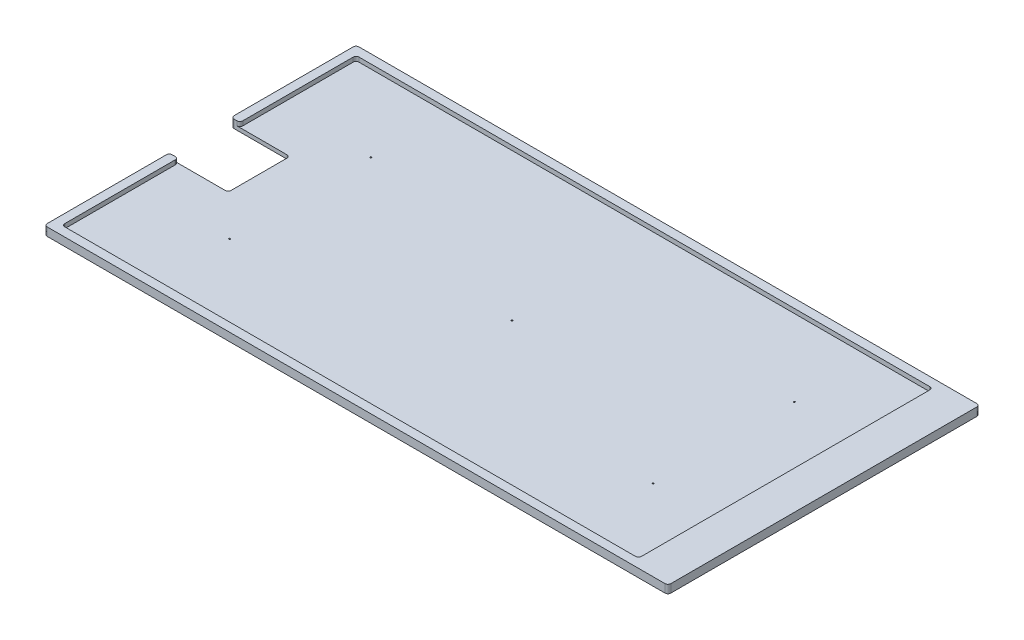
ISO-10303-21;
HEADER;
FILE_DESCRIPTION(('STEP AP214'),'2;1');
FILE_NAME('part.step','',(''),(''),'','','');
FILE_SCHEMA(('AUTOMOTIVE_DESIGN { 1 0 10303 214 1 1 1 1 }'));
ENDSEC;
DATA;
#1=APPLICATION_CONTEXT('core data for automotive mechanical design processes');
#2=APPLICATION_PROTOCOL_DEFINITION('international standard','automotive_design',2000,#1);
#3=PRODUCT_CONTEXT('',#1,'mechanical');
#4=PRODUCT('Part','Part','',(#3));
#5=PRODUCT_RELATED_PRODUCT_CATEGORY('part','',(#4));
#6=PRODUCT_DEFINITION_FORMATION('','',#4);
#7=PRODUCT_DEFINITION_CONTEXT('part definition',#1,'design');
#8=PRODUCT_DEFINITION('design','',#6,#7);
#9=PRODUCT_DEFINITION_SHAPE('','',#8);
#10=(LENGTH_UNIT() NAMED_UNIT(*) SI_UNIT(.MILLI.,.METRE.));
#11=(NAMED_UNIT(*) PLANE_ANGLE_UNIT() SI_UNIT($,.RADIAN.));
#12=(NAMED_UNIT(*) SI_UNIT($,.STERADIAN.) SOLID_ANGLE_UNIT());
#13=UNCERTAINTY_MEASURE_WITH_UNIT(LENGTH_MEASURE(1.E-05),#10,'distance_accuracy_value','');
#14=(GEOMETRIC_REPRESENTATION_CONTEXT(3) GLOBAL_UNCERTAINTY_ASSIGNED_CONTEXT((#13)) GLOBAL_UNIT_ASSIGNED_CONTEXT((#10,
#11,#12)) REPRESENTATION_CONTEXT('',''));
#15=CARTESIAN_POINT('',(0.,0.,0.));
#16=DIRECTION('',(0.,0.,1.));
#17=DIRECTION('',(1.,0.,0.));
#18=AXIS2_PLACEMENT_3D('',#15,#16,#17);
#19=CARTESIAN_POINT('',(-673.1,17.78,336.55));
#20=DIRECTION('',(1.,0.,0.));
#21=DIRECTION('',(0.,0.,-1.));
#22=AXIS2_PLACEMENT_3D('',#19,#20,#21);
#23=PLANE('',#22);
#24=DIRECTION('',(0.,0.,1.));
#25=VECTOR('',#24,1.);
#26=CARTESIAN_POINT('',(-673.1,0.,336.55));
#27=LINE('',#26,#25);
#28=CARTESIAN_POINT('',(-673.1,0.,-330.2));
#29=VERTEX_POINT('',#28);
#30=CARTESIAN_POINT('',(-673.1,0.,-73.025));
#31=VERTEX_POINT('',#30);
#32=EDGE_CURVE('E297',#29,#31,#27,.T.);
#33=ORIENTED_EDGE('',*,*,#32,.T.);
#34=DIRECTION('',(0.,1.,0.));
#35=VECTOR('',#34,1.);
#36=CARTESIAN_POINT('',(-673.1,17.78,-73.025));
#37=LINE('',#36,#35);
#38=CARTESIAN_POINT('',(-673.1,17.78,-73.025));
#39=VERTEX_POINT('',#38);
#40=EDGE_CURVE('E379',#31,#39,#37,.T.);
#41=ORIENTED_EDGE('',*,*,#40,.T.);
#42=DIRECTION('',(0.,0.,1.));
#43=VECTOR('',#42,1.);
#44=CARTESIAN_POINT('',(-673.1,17.78,336.55));
#45=LINE('',#44,#43);
#46=CARTESIAN_POINT('',(-673.1,17.78,-330.2));
#47=VERTEX_POINT('',#46);
#48=EDGE_CURVE('E284',#47,#39,#45,.T.);
#49=ORIENTED_EDGE('',*,*,#48,.F.);
#50=DIRECTION('',(0.,-1.,0.));
#51=VECTOR('',#50,1.);
#52=CARTESIAN_POINT('',(-673.1,17.78,-330.2));
#53=LINE('',#52,#51);
#54=EDGE_CURVE('E376',#47,#29,#53,.T.);
#55=ORIENTED_EDGE('',*,*,#54,.T.);
#56=EDGE_LOOP('',(#33,#41,#49,#55));
#57=FACE_BOUND('',#56,.T.);
#58=ADVANCED_FACE('F34',(#57),#23,.F.);
#59=CARTESIAN_POINT('',(673.1,17.78,336.55));
#60=DIRECTION('',(-1.,0.,0.));
#61=DIRECTION('',(0.,0.,1.));
#62=AXIS2_PLACEMENT_3D('',#59,#60,#61);
#63=PLANE('',#62);
#64=DIRECTION('',(0.,0.,-1.));
#65=VECTOR('',#64,1.);
#66=CARTESIAN_POINT('',(673.1,0.,336.55));
#67=LINE('',#66,#65);
#68=CARTESIAN_POINT('',(673.1,0.,330.2));
#69=VERTEX_POINT('',#68);
#70=CARTESIAN_POINT('',(673.1,0.,-330.2));
#71=VERTEX_POINT('',#70);
#72=EDGE_CURVE('E275',#69,#71,#67,.T.);
#73=ORIENTED_EDGE('',*,*,#72,.T.);
#74=DIRECTION('',(0.,-1.,0.));
#75=VECTOR('',#74,1.);
#76=CARTESIAN_POINT('',(673.1,17.78,-330.2));
#77=LINE('',#76,#75);
#78=CARTESIAN_POINT('',(673.1,17.78,-330.2));
#79=VERTEX_POINT('',#78);
#80=EDGE_CURVE('E390',#71,#79,#77,.F.);
#81=ORIENTED_EDGE('',*,*,#80,.T.);
#82=DIRECTION('',(0.,0.,-1.));
#83=VECTOR('',#82,1.);
#84=CARTESIAN_POINT('',(673.1,17.78,336.55));
#85=LINE('',#84,#83);
#86=CARTESIAN_POINT('',(673.1,17.78,330.2));
#87=VERTEX_POINT('',#86);
#88=EDGE_CURVE('E276',#87,#79,#85,.T.);
#89=ORIENTED_EDGE('',*,*,#88,.F.);
#90=DIRECTION('',(0.,-1.,0.));
#91=VECTOR('',#90,1.);
#92=CARTESIAN_POINT('',(673.1,17.78,330.2));
#93=LINE('',#92,#91);
#94=EDGE_CURVE('E387',#87,#69,#93,.T.);
#95=ORIENTED_EDGE('',*,*,#94,.T.);
#96=EDGE_LOOP('',(#73,#81,#89,#95));
#97=FACE_BOUND('',#96,.T.);
#98=ADVANCED_FACE('F526',(#97),#63,.F.);
#99=CARTESIAN_POINT('',(-673.1,17.78,-336.55));
#100=DIRECTION('',(0.,0.,1.));
#101=DIRECTION('',(1.,0.,0.));
#102=AXIS2_PLACEMENT_3D('',#99,#100,#101);
#103=PLANE('',#102);
#104=DIRECTION('',(-1.,0.,0.));
#105=VECTOR('',#104,1.);
#106=CARTESIAN_POINT('',(-673.1,17.78,-336.55));
#107=LINE('',#106,#105);
#108=CARTESIAN_POINT('',(666.75,17.78,-336.55));
#109=VERTEX_POINT('',#108);
#110=CARTESIAN_POINT('',(-666.75,17.78,-336.55));
#111=VERTEX_POINT('',#110);
#112=EDGE_CURVE('E279',#109,#111,#107,.T.);
#113=ORIENTED_EDGE('',*,*,#112,.F.);
#114=DIRECTION('',(0.,-1.,0.));
#115=VECTOR('',#114,1.);
#116=CARTESIAN_POINT('',(666.75,17.78,-336.55));
#117=LINE('',#116,#115);
#118=CARTESIAN_POINT('',(666.75,0.,-336.55));
#119=VERTEX_POINT('',#118);
#120=EDGE_CURVE('E384',#109,#119,#117,.T.);
#121=ORIENTED_EDGE('',*,*,#120,.T.);
#122=DIRECTION('',(-1.,0.,0.));
#123=VECTOR('',#122,1.);
#124=CARTESIAN_POINT('',(-673.1,0.,-336.55));
#125=LINE('',#124,#123);
#126=CARTESIAN_POINT('',(-666.75,0.,-336.55));
#127=VERTEX_POINT('',#126);
#128=EDGE_CURVE('E293',#119,#127,#125,.T.);
#129=ORIENTED_EDGE('',*,*,#128,.T.);
#130=DIRECTION('',(0.,-1.,0.));
#131=VECTOR('',#130,1.);
#132=CARTESIAN_POINT('',(-666.75,17.78,-336.55));
#133=LINE('',#132,#131);
#134=EDGE_CURVE('E382',#127,#111,#133,.F.);
#135=ORIENTED_EDGE('',*,*,#134,.T.);
#136=EDGE_LOOP('',(#113,#121,#129,#135));
#137=FACE_BOUND('',#136,.T.);
#138=ADVANCED_FACE('F517',(#137),#103,.F.);
#139=CARTESIAN_POINT('',(-673.1,17.78,73.025));
#140=VERTEX_POINT('',#139);
#141=CARTESIAN_POINT('',(-673.1,17.78,330.2));
#142=VERTEX_POINT('',#141);
#143=EDGE_CURVE('E283',#140,#142,#45,.T.);
#144=ORIENTED_EDGE('',*,*,#143,.F.);
#145=DIRECTION('',(0.,1.,0.));
#146=VECTOR('',#145,1.);
#147=CARTESIAN_POINT('',(-673.1,17.78,73.025));
#148=LINE('',#147,#146);
#149=CARTESIAN_POINT('',(-673.1,0.,73.025));
#150=VERTEX_POINT('',#149);
#151=EDGE_CURVE('E225',#140,#150,#148,.F.);
#152=ORIENTED_EDGE('',*,*,#151,.T.);
#153=CARTESIAN_POINT('',(-673.1,0.,330.2));
#154=VERTEX_POINT('',#153);
#155=EDGE_CURVE('E296',#150,#154,#27,.T.);
#156=ORIENTED_EDGE('',*,*,#155,.T.);
#157=DIRECTION('',(0.,-1.,0.));
#158=VECTOR('',#157,1.);
#159=CARTESIAN_POINT('',(-673.1,17.78,330.2));
#160=LINE('',#159,#158);
#161=EDGE_CURVE('E357',#154,#142,#160,.F.);
#162=ORIENTED_EDGE('',*,*,#161,.T.);
#163=EDGE_LOOP('',(#144,#152,#156,#162));
#164=FACE_BOUND('',#163,.T.);
#165=ADVANCED_FACE('F544',(#164),#23,.F.);
#166=CARTESIAN_POINT('',(-673.1,17.78,336.55));
#167=DIRECTION('',(0.,0.,-1.));
#168=DIRECTION('',(-1.,0.,0.));
#169=AXIS2_PLACEMENT_3D('',#166,#167,#168);
#170=PLANE('',#169);
#171=DIRECTION('',(1.,0.,0.));
#172=VECTOR('',#171,1.);
#173=CARTESIAN_POINT('',(-673.1,0.,336.55));
#174=LINE('',#173,#172);
#175=CARTESIAN_POINT('',(-666.75,0.,336.55));
#176=VERTEX_POINT('',#175);
#177=CARTESIAN_POINT('',(666.75,0.,336.55));
#178=VERTEX_POINT('',#177);
#179=EDGE_CURVE('E280',#176,#178,#174,.T.);
#180=ORIENTED_EDGE('',*,*,#179,.T.);
#181=DIRECTION('',(0.,-1.,0.));
#182=VECTOR('',#181,1.);
#183=CARTESIAN_POINT('',(666.75,17.78,336.55));
#184=LINE('',#183,#182);
#185=CARTESIAN_POINT('',(666.75,17.78,336.55));
#186=VERTEX_POINT('',#185);
#187=EDGE_CURVE('E395',#178,#186,#184,.F.);
#188=ORIENTED_EDGE('',*,*,#187,.T.);
#189=DIRECTION('',(1.,0.,0.));
#190=VECTOR('',#189,1.);
#191=CARTESIAN_POINT('',(-673.1,17.78,336.55));
#192=LINE('',#191,#190);
#193=CARTESIAN_POINT('',(-666.75,17.78,336.55));
#194=VERTEX_POINT('',#193);
#195=EDGE_CURVE('E287',#194,#186,#192,.T.);
#196=ORIENTED_EDGE('',*,*,#195,.F.);
#197=DIRECTION('',(0.,-1.,0.));
#198=VECTOR('',#197,1.);
#199=CARTESIAN_POINT('',(-666.75,17.78,336.55));
#200=LINE('',#199,#198);
#201=EDGE_CURVE('E392',#194,#176,#200,.T.);
#202=ORIENTED_EDGE('',*,*,#201,.T.);
#203=EDGE_LOOP('',(#180,#188,#196,#202));
#204=FACE_BOUND('',#203,.T.);
#205=ADVANCED_FACE('F535',(#204),#170,.F.);
#206=CARTESIAN_POINT('',(0.,17.78,0.));
#207=DIRECTION('',(0.,-1.,0.));
#208=DIRECTION('',(0.,0.,-1.));
#209=AXIS2_PLACEMENT_3D('',#206,#207,#208);
#210=PLANE('',#209);
#211=DIRECTION('',(0.,0.,1.));
#212=VECTOR('',#211,1.);
#213=CARTESIAN_POINT('',(-654.05,17.78,317.5));
#214=LINE('',#213,#212);
#215=CARTESIAN_POINT('',(-654.05,17.78,73.0250000000001));
#216=VERTEX_POINT('',#215);
#217=CARTESIAN_POINT('',(-654.05,17.78,311.15));
#218=VERTEX_POINT('',#217);
#219=EDGE_CURVE('E459',#216,#218,#214,.T.);
#220=ORIENTED_EDGE('',*,*,#219,.F.);
#221=CARTESIAN_POINT('',(-660.4,17.78,73.025));
#222=DIRECTION('',(0.,-1.,0.));
#223=DIRECTION('',(0.,0.,-1.));
#224=AXIS2_PLACEMENT_3D('',#221,#222,#223);
#225=CIRCLE('',#224,6.35);
#226=CARTESIAN_POINT('',(-660.4,17.78,66.675));
#227=VERTEX_POINT('',#226);
#228=EDGE_CURVE('E247',#216,#227,#225,.F.);
#229=ORIENTED_EDGE('',*,*,#228,.T.);
#230=DIRECTION('',(1.,0.,0.));
#231=VECTOR('',#230,1.);
#232=CARTESIAN_POINT('',(-546.1,17.78,66.675));
#233=LINE('',#232,#231);
#234=CARTESIAN_POINT('',(-666.75,17.78,66.675));
#235=VERTEX_POINT('',#234);
#236=EDGE_CURVE('E238',#235,#227,#233,.T.);
#237=ORIENTED_EDGE('',*,*,#236,.F.);
#238=CARTESIAN_POINT('',(-666.75,17.78,73.025));
#239=DIRECTION('',(0.,-1.,0.));
#240=DIRECTION('',(0.,0.,-1.));
#241=AXIS2_PLACEMENT_3D('',#238,#239,#240);
#242=CIRCLE('',#241,6.35);
#243=EDGE_CURVE('E220',#235,#140,#242,.F.);
#244=ORIENTED_EDGE('',*,*,#243,.T.);
#245=ORIENTED_EDGE('',*,*,#143,.T.);
#246=CARTESIAN_POINT('',(-666.75,17.78,330.2));
#247=DIRECTION('',(0.,-1.,0.));
#248=DIRECTION('',(0.,0.,-1.));
#249=AXIS2_PLACEMENT_3D('',#246,#247,#248);
#250=CIRCLE('',#249,6.35);
#251=EDGE_CURVE('E312',#142,#194,#250,.F.);
#252=ORIENTED_EDGE('',*,*,#251,.T.);
#253=ORIENTED_EDGE('',*,*,#195,.T.);
#254=CARTESIAN_POINT('',(666.75,17.78,330.2));
#255=DIRECTION('',(0.,-1.,0.));
#256=DIRECTION('',(0.,0.,-1.));
#257=AXIS2_PLACEMENT_3D('',#254,#255,#256);
#258=CIRCLE('',#257,6.35);
#259=EDGE_CURVE('E314',#186,#87,#258,.F.);
#260=ORIENTED_EDGE('',*,*,#259,.T.);
#261=ORIENTED_EDGE('',*,*,#88,.T.);
#262=CARTESIAN_POINT('',(666.75,17.78,-330.2));
#263=DIRECTION('',(0.,-1.,0.));
#264=DIRECTION('',(0.,0.,-1.));
#265=AXIS2_PLACEMENT_3D('',#262,#263,#264);
#266=CIRCLE('',#265,6.35);
#267=EDGE_CURVE('E316',#79,#109,#266,.F.);
#268=ORIENTED_EDGE('',*,*,#267,.T.);
#269=ORIENTED_EDGE('',*,*,#112,.T.);
#270=CARTESIAN_POINT('',(-666.75,17.78,-330.2));
#271=DIRECTION('',(0.,-1.,0.));
#272=DIRECTION('',(0.,0.,-1.));
#273=AXIS2_PLACEMENT_3D('',#270,#271,#272);
#274=CIRCLE('',#273,6.35);
#275=EDGE_CURVE('E310',#111,#47,#274,.F.);
#276=ORIENTED_EDGE('',*,*,#275,.T.);
#277=ORIENTED_EDGE('',*,*,#48,.T.);
#278=CARTESIAN_POINT('',(-666.75,17.78,-73.025));
#279=DIRECTION('',(0.,-1.,0.));
#280=DIRECTION('',(0.,0.,-1.));
#281=AXIS2_PLACEMENT_3D('',#278,#279,#280);
#282=CIRCLE('',#281,6.35);
#283=CARTESIAN_POINT('',(-666.75,17.78,-66.675));
#284=VERTEX_POINT('',#283);
#285=EDGE_CURVE('E231',#39,#284,#282,.F.);
#286=ORIENTED_EDGE('',*,*,#285,.T.);
#287=DIRECTION('',(-1.,0.,0.));
#288=VECTOR('',#287,1.);
#289=CARTESIAN_POINT('',(-546.1,17.78,-66.675));
#290=LINE('',#289,#288);
#291=CARTESIAN_POINT('',(-660.4,17.78,-66.675));
#292=VERTEX_POINT('',#291);
#293=EDGE_CURVE('E248',#292,#284,#290,.T.);
#294=ORIENTED_EDGE('',*,*,#293,.F.);
#295=CARTESIAN_POINT('',(-660.4,17.78,-73.025));
#296=DIRECTION('',(0.,-1.,0.));
#297=DIRECTION('',(0.,0.,-1.));
#298=AXIS2_PLACEMENT_3D('',#295,#296,#297);
#299=CIRCLE('',#298,6.35);
#300=CARTESIAN_POINT('',(-654.05,17.78,-73.0249999999999));
#301=VERTEX_POINT('',#300);
#302=EDGE_CURVE('E230',#292,#301,#299,.F.);
#303=ORIENTED_EDGE('',*,*,#302,.T.);
#304=CARTESIAN_POINT('',(-654.05,17.78,-311.15));
#305=VERTEX_POINT('',#304);
#306=EDGE_CURVE('E456',#305,#301,#214,.T.);
#307=ORIENTED_EDGE('',*,*,#306,.F.);
#308=CARTESIAN_POINT('',(-647.7,17.78,-311.15));
#309=DIRECTION('',(0.,-1.,0.));
#310=DIRECTION('',(0.,0.,-1.));
#311=AXIS2_PLACEMENT_3D('',#308,#309,#310);
#312=CIRCLE('',#311,6.35);
#313=CARTESIAN_POINT('',(-647.7,17.78,-317.5));
#314=VERTEX_POINT('',#313);
#315=EDGE_CURVE('E408',#305,#314,#312,.T.);
#316=ORIENTED_EDGE('',*,*,#315,.T.);
#317=DIRECTION('',(-1.,0.,0.));
#318=VECTOR('',#317,1.);
#319=CARTESIAN_POINT('',(-654.05,17.78,-317.5));
#320=LINE('',#319,#318);
#321=CARTESIAN_POINT('',(584.2,17.78,-317.5));
#322=VERTEX_POINT('',#321);
#323=EDGE_CURVE('E460',#322,#314,#320,.T.);
#324=ORIENTED_EDGE('',*,*,#323,.F.);
#325=CARTESIAN_POINT('',(584.2,17.78,-311.15));
#326=DIRECTION('',(0.,-1.,0.));
#327=DIRECTION('',(0.,0.,-1.));
#328=AXIS2_PLACEMENT_3D('',#325,#326,#327);
#329=CIRCLE('',#328,6.35);
#330=CARTESIAN_POINT('',(590.55,17.78,-311.15));
#331=VERTEX_POINT('',#330);
#332=EDGE_CURVE('E406',#322,#331,#329,.T.);
#333=ORIENTED_EDGE('',*,*,#332,.T.);
#334=DIRECTION('',(0.,0.,-1.));
#335=VECTOR('',#334,1.);
#336=CARTESIAN_POINT('',(590.55,17.78,317.5));
#337=LINE('',#336,#335);
#338=CARTESIAN_POINT('',(590.55,17.78,311.15));
#339=VERTEX_POINT('',#338);
#340=EDGE_CURVE('E463',#339,#331,#337,.T.);
#341=ORIENTED_EDGE('',*,*,#340,.F.);
#342=CARTESIAN_POINT('',(584.2,17.78,311.15));
#343=DIRECTION('',(0.,-1.,0.));
#344=DIRECTION('',(0.,0.,-1.));
#345=AXIS2_PLACEMENT_3D('',#342,#343,#344);
#346=CIRCLE('',#345,6.35);
#347=CARTESIAN_POINT('',(584.2,17.78,317.5));
#348=VERTEX_POINT('',#347);
#349=EDGE_CURVE('E404',#339,#348,#346,.T.);
#350=ORIENTED_EDGE('',*,*,#349,.T.);
#351=DIRECTION('',(1.,0.,0.));
#352=VECTOR('',#351,1.);
#353=CARTESIAN_POINT('',(-654.05,17.78,317.5));
#354=LINE('',#353,#352);
#355=CARTESIAN_POINT('',(-647.7,17.78,317.5));
#356=VERTEX_POINT('',#355);
#357=EDGE_CURVE('E452',#356,#348,#354,.T.);
#358=ORIENTED_EDGE('',*,*,#357,.F.);
#359=CARTESIAN_POINT('',(-647.7,17.78,311.15));
#360=DIRECTION('',(0.,-1.,0.));
#361=DIRECTION('',(0.,0.,-1.));
#362=AXIS2_PLACEMENT_3D('',#359,#360,#361);
#363=CIRCLE('',#362,6.35);
#364=EDGE_CURVE('E402',#356,#218,#363,.T.);
#365=ORIENTED_EDGE('',*,*,#364,.T.);
#366=EDGE_LOOP('',(#220,#229,#237,#244,#245,#252,#253,#260,#261,#268,#269,#276,#277,#286,#294,
#303,#307,#316,#324,#333,#341,#350,#358,#365));
#367=FACE_BOUND('',#366,.T.);
#368=ADVANCED_FACE('F245',(#367),#210,.F.);
#369=CARTESIAN_POINT('',(0.,0.,0.));
#370=DIRECTION('',(0.,-1.,0.));
#371=DIRECTION('',(0.,0.,-1.));
#372=AXIS2_PLACEMENT_3D('',#369,#370,#371);
#373=PLANE('',#372);
#374=ORIENTED_EDGE('',*,*,#155,.F.);
#375=CARTESIAN_POINT('',(-666.75,0.,73.025));
#376=DIRECTION('',(0.,-1.,0.));
#377=DIRECTION('',(0.,0.,-1.));
#378=AXIS2_PLACEMENT_3D('',#375,#376,#377);
#379=CIRCLE('',#378,6.35);
#380=CARTESIAN_POINT('',(-666.75,0.,66.675));
#381=VERTEX_POINT('',#380);
#382=EDGE_CURVE('E370',#150,#381,#379,.T.);
#383=ORIENTED_EDGE('',*,*,#382,.T.);
#384=DIRECTION('',(1.,0.,0.));
#385=VECTOR('',#384,1.);
#386=CARTESIAN_POINT('',(-546.1,0.,66.675));
#387=LINE('',#386,#385);
#388=CARTESIAN_POINT('',(-552.45,0.,66.675));
#389=VERTEX_POINT('',#388);
#390=EDGE_CURVE('E240',#381,#389,#387,.T.);
#391=ORIENTED_EDGE('',*,*,#390,.T.);
#392=CARTESIAN_POINT('',(-552.45,0.,60.325));
#393=DIRECTION('',(0.,-1.,0.));
#394=DIRECTION('',(0.,0.,-1.));
#395=AXIS2_PLACEMENT_3D('',#392,#393,#394);
#396=CIRCLE('',#395,6.35);
#397=CARTESIAN_POINT('',(-546.1,0.,60.325));
#398=VERTEX_POINT('',#397);
#399=EDGE_CURVE('E56',#389,#398,#396,.F.);
#400=ORIENTED_EDGE('',*,*,#399,.T.);
#401=DIRECTION('',(0.,0.,-1.));
#402=VECTOR('',#401,1.);
#403=CARTESIAN_POINT('',(-546.1,0.,-66.675));
#404=LINE('',#403,#402);
#405=CARTESIAN_POINT('',(-546.1,0.,-60.325));
#406=VERTEX_POINT('',#405);
#407=EDGE_CURVE('E434',#398,#406,#404,.T.);
#408=ORIENTED_EDGE('',*,*,#407,.T.);
#409=CARTESIAN_POINT('',(-552.45,0.,-60.325));
#410=DIRECTION('',(0.,-1.,0.));
#411=DIRECTION('',(0.,0.,-1.));
#412=AXIS2_PLACEMENT_3D('',#409,#410,#411);
#413=CIRCLE('',#412,6.35);
#414=CARTESIAN_POINT('',(-552.45,0.,-66.675));
#415=VERTEX_POINT('',#414);
#416=EDGE_CURVE('E11',#406,#415,#413,.F.);
#417=ORIENTED_EDGE('',*,*,#416,.T.);
#418=DIRECTION('',(-1.,0.,0.));
#419=VECTOR('',#418,1.);
#420=CARTESIAN_POINT('',(-546.1,0.,-66.675));
#421=LINE('',#420,#419);
#422=CARTESIAN_POINT('',(-666.75,0.,-66.675));
#423=VERTEX_POINT('',#422);
#424=EDGE_CURVE('E257',#415,#423,#421,.T.);
#425=ORIENTED_EDGE('',*,*,#424,.T.);
#426=CARTESIAN_POINT('',(-666.75,0.,-73.025));
#427=DIRECTION('',(0.,-1.,0.));
#428=DIRECTION('',(0.,0.,-1.));
#429=AXIS2_PLACEMENT_3D('',#426,#427,#428);
#430=CIRCLE('',#429,6.35);
#431=EDGE_CURVE('E368',#423,#31,#430,.T.);
#432=ORIENTED_EDGE('',*,*,#431,.T.);
#433=ORIENTED_EDGE('',*,*,#32,.F.);
#434=CARTESIAN_POINT('',(-666.75,0.,-330.2));
#435=DIRECTION('',(0.,-1.,0.));
#436=DIRECTION('',(0.,0.,-1.));
#437=AXIS2_PLACEMENT_3D('',#434,#435,#436);
#438=CIRCLE('',#437,6.35);
#439=EDGE_CURVE('E360',#29,#127,#438,.T.);
#440=ORIENTED_EDGE('',*,*,#439,.T.);
#441=ORIENTED_EDGE('',*,*,#128,.F.);
#442=CARTESIAN_POINT('',(666.75,0.,-330.2));
#443=DIRECTION('',(0.,-1.,0.));
#444=DIRECTION('',(0.,0.,-1.));
#445=AXIS2_PLACEMENT_3D('',#442,#443,#444);
#446=CIRCLE('',#445,6.35);
#447=EDGE_CURVE('E366',#119,#71,#446,.T.);
#448=ORIENTED_EDGE('',*,*,#447,.T.);
#449=ORIENTED_EDGE('',*,*,#72,.F.);
#450=CARTESIAN_POINT('',(666.75,0.,330.2));
#451=DIRECTION('',(0.,-1.,0.));
#452=DIRECTION('',(0.,0.,-1.));
#453=AXIS2_PLACEMENT_3D('',#450,#451,#452);
#454=CIRCLE('',#453,6.35);
#455=EDGE_CURVE('E364',#69,#178,#454,.T.);
#456=ORIENTED_EDGE('',*,*,#455,.T.);
#457=ORIENTED_EDGE('',*,*,#179,.F.);
#458=CARTESIAN_POINT('',(-666.75,0.,330.2));
#459=DIRECTION('',(0.,-1.,0.));
#460=DIRECTION('',(0.,0.,-1.));
#461=AXIS2_PLACEMENT_3D('',#458,#459,#460);
#462=CIRCLE('',#461,6.35);
#463=EDGE_CURVE('E362',#176,#154,#462,.T.);
#464=ORIENTED_EDGE('',*,*,#463,.T.);
#465=EDGE_LOOP('',(#374,#383,#391,#400,#408,#417,#425,#432,#433,#440,#441,#448,#449,#456,#457,#464));
#466=FACE_BOUND('',#465,.T.);
#467=CARTESIAN_POINT('',(457.2,0.,-152.4));
#468=DIRECTION('',(0.,1.,0.));
#469=DIRECTION('',(0.,0.,1.));
#470=AXIS2_PLACEMENT_3D('',#467,#468,#469);
#471=CIRCLE('',#470,1.58750000000002);
#472=CARTESIAN_POINT('',(457.2,0.,-150.8125));
#473=VERTEX_POINT('',#472);
#474=EDGE_CURVE('E260',#473,#473,#471,.T.);
#475=ORIENTED_EDGE('',*,*,#474,.T.);
#476=EDGE_LOOP('',(#475));
#477=FACE_BOUND('',#476,.T.);
#478=CARTESIAN_POINT('',(-457.2,0.,152.4));
#479=DIRECTION('',(0.,1.,0.));
#480=DIRECTION('',(0.,0.,1.));
#481=AXIS2_PLACEMENT_3D('',#478,#479,#480);
#482=CIRCLE('',#481,1.58750000000002);
#483=CARTESIAN_POINT('',(-457.2,0.,153.9875));
#484=VERTEX_POINT('',#483);
#485=EDGE_CURVE('E263',#484,#484,#482,.T.);
#486=ORIENTED_EDGE('',*,*,#485,.T.);
#487=EDGE_LOOP('',(#486));
#488=FACE_BOUND('',#487,.T.);
#489=CARTESIAN_POINT('',(-457.2,0.,-152.4));
#490=DIRECTION('',(0.,1.,0.));
#491=DIRECTION('',(0.,0.,1.));
#492=AXIS2_PLACEMENT_3D('',#489,#490,#491);
#493=CIRCLE('',#492,1.58750000000002);
#494=CARTESIAN_POINT('',(-457.2,0.,-150.8125));
#495=VERTEX_POINT('',#494);
#496=EDGE_CURVE('E266',#495,#495,#493,.T.);
#497=ORIENTED_EDGE('',*,*,#496,.T.);
#498=EDGE_LOOP('',(#497));
#499=FACE_BOUND('',#498,.T.);
#500=CARTESIAN_POINT('',(457.2,0.,152.4));
#501=DIRECTION('',(0.,1.,0.));
#502=DIRECTION('',(0.,0.,1.));
#503=AXIS2_PLACEMENT_3D('',#500,#501,#502);
#504=CIRCLE('',#503,1.58750000000002);
#505=CARTESIAN_POINT('',(457.2,0.,153.9875));
#506=VERTEX_POINT('',#505);
#507=EDGE_CURVE('E269',#506,#506,#504,.T.);
#508=ORIENTED_EDGE('',*,*,#507,.T.);
#509=EDGE_LOOP('',(#508));
#510=FACE_BOUND('',#509,.T.);
#511=CARTESIAN_POINT('',(0.,0.,0.));
#512=DIRECTION('',(0.,1.,0.));
#513=DIRECTION('',(0.,0.,1.));
#514=AXIS2_PLACEMENT_3D('',#511,#512,#513);
#515=CIRCLE('',#514,1.5875);
#516=CARTESIAN_POINT('',(0.,0.,1.5875));
#517=VERTEX_POINT('',#516);
#518=EDGE_CURVE('E272',#517,#517,#515,.T.);
#519=ORIENTED_EDGE('',*,*,#518,.T.);
#520=EDGE_LOOP('',(#519));
#521=FACE_BOUND('',#520,.T.);
#522=ADVANCED_FACE('F431',(#466,#477,#488,#499,#510,#521),#373,.T.);
#523=CARTESIAN_POINT('',(0.,17.78,0.));
#524=DIRECTION('',(0.,1.,0.));
#525=DIRECTION('',(0.,0.,1.));
#526=AXIS2_PLACEMENT_3D('',#523,#524,#525);
#527=CYLINDRICAL_SURFACE('',#526,1.58749999999999);
#528=CARTESIAN_POINT('',(0.,8.255,0.));
#529=DIRECTION('',(0.,-1.,0.));
#530=DIRECTION('',(0.,0.,-1.));
#531=AXIS2_PLACEMENT_3D('',#528,#529,#530);
#532=CIRCLE('',#531,1.58749999999999);
#533=CARTESIAN_POINT('',(0.,8.255,-1.58749999999999));
#534=VERTEX_POINT('',#533);
#535=EDGE_CURVE('E249',#534,#534,#532,.F.);
#536=ORIENTED_EDGE('',*,*,#535,.T.);
#537=EDGE_LOOP('',(#536));
#538=FACE_BOUND('',#537,.T.);
#539=ORIENTED_EDGE('',*,*,#518,.F.);
#540=EDGE_LOOP('',(#539));
#541=FACE_BOUND('',#540,.T.);
#542=ADVANCED_FACE('F619',(#538,#541),#527,.F.);
#543=CARTESIAN_POINT('',(457.2,17.78,152.4));
#544=DIRECTION('',(0.,1.,0.));
#545=DIRECTION('',(0.,0.,1.));
#546=AXIS2_PLACEMENT_3D('',#543,#544,#545);
#547=CYLINDRICAL_SURFACE('',#546,1.58749999999999);
#548=CARTESIAN_POINT('',(457.2,8.255,152.4));
#549=DIRECTION('',(0.,-1.,0.));
#550=DIRECTION('',(0.,0.,-1.));
#551=AXIS2_PLACEMENT_3D('',#548,#549,#550);
#552=CIRCLE('',#551,1.58749999999999);
#553=CARTESIAN_POINT('',(457.2,8.255,150.8125));
#554=VERTEX_POINT('',#553);
#555=EDGE_CURVE('E254',#554,#554,#552,.F.);
#556=ORIENTED_EDGE('',*,*,#555,.T.);
#557=EDGE_LOOP('',(#556));
#558=FACE_BOUND('',#557,.T.);
#559=ORIENTED_EDGE('',*,*,#507,.F.);
#560=EDGE_LOOP('',(#559));
#561=FACE_BOUND('',#560,.T.);
#562=ADVANCED_FACE('F666',(#558,#561),#547,.F.);
#563=CARTESIAN_POINT('',(-457.2,17.78,-152.4));
#564=DIRECTION('',(0.,1.,0.));
#565=DIRECTION('',(0.,0.,1.));
#566=AXIS2_PLACEMENT_3D('',#563,#564,#565);
#567=CYLINDRICAL_SURFACE('',#566,1.58749999999999);
#568=CARTESIAN_POINT('',(-457.2,8.255,-152.4));
#569=DIRECTION('',(0.,-1.,0.));
#570=DIRECTION('',(0.,0.,-1.));
#571=AXIS2_PLACEMENT_3D('',#568,#569,#570);
#572=CIRCLE('',#571,1.58749999999999);
#573=CARTESIAN_POINT('',(-457.2,8.255,-153.9875));
#574=VERTEX_POINT('',#573);
#575=EDGE_CURVE('E442',#574,#574,#572,.F.);
#576=ORIENTED_EDGE('',*,*,#575,.T.);
#577=EDGE_LOOP('',(#576));
#578=FACE_BOUND('',#577,.T.);
#579=ORIENTED_EDGE('',*,*,#496,.F.);
#580=EDGE_LOOP('',(#579));
#581=FACE_BOUND('',#580,.T.);
#582=ADVANCED_FACE('F676',(#578,#581),#567,.F.);
#583=CARTESIAN_POINT('',(-457.2,17.78,152.4));
#584=DIRECTION('',(0.,1.,0.));
#585=DIRECTION('',(0.,0.,1.));
#586=AXIS2_PLACEMENT_3D('',#583,#584,#585);
#587=CYLINDRICAL_SURFACE('',#586,1.58749999999999);
#588=CARTESIAN_POINT('',(-457.2,8.255,152.4));
#589=DIRECTION('',(0.,-1.,0.));
#590=DIRECTION('',(0.,0.,-1.));
#591=AXIS2_PLACEMENT_3D('',#588,#589,#590);
#592=CIRCLE('',#591,1.58749999999999);
#593=CARTESIAN_POINT('',(-457.2,8.255,150.8125));
#594=VERTEX_POINT('',#593);
#595=EDGE_CURVE('E445',#594,#594,#592,.F.);
#596=ORIENTED_EDGE('',*,*,#595,.T.);
#597=EDGE_LOOP('',(#596));
#598=FACE_BOUND('',#597,.T.);
#599=ORIENTED_EDGE('',*,*,#485,.F.);
#600=EDGE_LOOP('',(#599));
#601=FACE_BOUND('',#600,.T.);
#602=ADVANCED_FACE('F686',(#598,#601),#587,.F.);
#603=CARTESIAN_POINT('',(457.2,17.78,-152.4));
#604=DIRECTION('',(0.,1.,0.));
#605=DIRECTION('',(0.,0.,1.));
#606=AXIS2_PLACEMENT_3D('',#603,#604,#605);
#607=CYLINDRICAL_SURFACE('',#606,1.58749999999999);
#608=CARTESIAN_POINT('',(457.2,8.255,-152.4));
#609=DIRECTION('',(0.,-1.,0.));
#610=DIRECTION('',(0.,0.,-1.));
#611=AXIS2_PLACEMENT_3D('',#608,#609,#610);
#612=CIRCLE('',#611,1.58749999999999);
#613=CARTESIAN_POINT('',(457.2,8.255,-153.9875));
#614=VERTEX_POINT('',#613);
#615=EDGE_CURVE('E448',#614,#614,#612,.F.);
#616=ORIENTED_EDGE('',*,*,#615,.T.);
#617=EDGE_LOOP('',(#616));
#618=FACE_BOUND('',#617,.T.);
#619=ORIENTED_EDGE('',*,*,#474,.F.);
#620=EDGE_LOOP('',(#619));
#621=FACE_BOUND('',#620,.T.);
#622=ADVANCED_FACE('F696',(#618,#621),#607,.F.);
#623=CARTESIAN_POINT('',(-546.1,0.,-66.675));
#624=DIRECTION('',(0.,0.,-1.));
#625=DIRECTION('',(-1.,0.,0.));
#626=AXIS2_PLACEMENT_3D('',#623,#624,#625);
#627=PLANE('',#626);
#628=DIRECTION('',(-1.,0.,0.));
#629=VECTOR('',#628,1.);
#630=CARTESIAN_POINT('',(-546.1,8.255,-66.675));
#631=LINE('',#630,#629);
#632=CARTESIAN_POINT('',(-552.45,8.255,-66.675));
#633=VERTEX_POINT('',#632);
#634=CARTESIAN_POINT('',(-660.4,8.255,-66.675));
#635=VERTEX_POINT('',#634);
#636=EDGE_CURVE('E419',#633,#635,#631,.T.);
#637=ORIENTED_EDGE('',*,*,#636,.T.);
#638=DIRECTION('',(0.,1.,0.));
#639=VECTOR('',#638,1.);
#640=CARTESIAN_POINT('',(-660.4,0.,-66.675));
#641=LINE('',#640,#639);
#642=EDGE_CURVE('E326',#635,#292,#641,.T.);
#643=ORIENTED_EDGE('',*,*,#642,.T.);
#644=ORIENTED_EDGE('',*,*,#293,.T.);
#645=DIRECTION('',(0.,1.,0.));
#646=VECTOR('',#645,1.);
#647=CARTESIAN_POINT('',(-666.75,0.,-66.675));
#648=LINE('',#647,#646);
#649=EDGE_CURVE('E324',#284,#423,#648,.F.);
#650=ORIENTED_EDGE('',*,*,#649,.T.);
#651=ORIENTED_EDGE('',*,*,#424,.F.);
#652=DIRECTION('',(0.,1.,0.));
#653=VECTOR('',#652,1.);
#654=CARTESIAN_POINT('',(-552.45,8.255,-66.675));
#655=LINE('',#654,#653);
#656=EDGE_CURVE('E321',#415,#633,#655,.T.);
#657=ORIENTED_EDGE('',*,*,#656,.T.);
#658=EDGE_LOOP('',(#637,#643,#644,#650,#651,#657));
#659=FACE_BOUND('',#658,.T.);
#660=ADVANCED_FACE('F436',(#659),#627,.F.);
#661=CARTESIAN_POINT('',(-546.1,0.,-66.675));
#662=DIRECTION('',(1.,0.,0.));
#663=DIRECTION('',(0.,0.,-1.));
#664=AXIS2_PLACEMENT_3D('',#661,#662,#663);
#665=PLANE('',#664);
#666=ORIENTED_EDGE('',*,*,#407,.F.);
#667=DIRECTION('',(0.,1.,0.));
#668=VECTOR('',#667,1.);
#669=CARTESIAN_POINT('',(-546.1,8.255,60.325));
#670=LINE('',#669,#668);
#671=CARTESIAN_POINT('',(-546.1,8.255,60.325));
#672=VERTEX_POINT('',#671);
#673=EDGE_CURVE('E373',#398,#672,#670,.T.);
#674=ORIENTED_EDGE('',*,*,#673,.T.);
#675=DIRECTION('',(0.,0.,-1.));
#676=VECTOR('',#675,1.);
#677=CARTESIAN_POINT('',(-546.1,8.255,-66.675));
#678=LINE('',#677,#676);
#679=CARTESIAN_POINT('',(-546.1,8.255,-60.325));
#680=VERTEX_POINT('',#679);
#681=EDGE_CURVE('E418',#672,#680,#678,.T.);
#682=ORIENTED_EDGE('',*,*,#681,.T.);
#683=DIRECTION('',(0.,1.,0.));
#684=VECTOR('',#683,1.);
#685=CARTESIAN_POINT('',(-546.1,0.,-60.325));
#686=LINE('',#685,#684);
#687=EDGE_CURVE('E49',#680,#406,#686,.F.);
#688=ORIENTED_EDGE('',*,*,#687,.T.);
#689=EDGE_LOOP('',(#666,#674,#682,#688));
#690=FACE_BOUND('',#689,.T.);
#691=ADVANCED_FACE('F422',(#690),#665,.F.);
#692=CARTESIAN_POINT('',(-546.1,0.,66.675));
#693=DIRECTION('',(0.,0.,1.));
#694=DIRECTION('',(1.,0.,0.));
#695=AXIS2_PLACEMENT_3D('',#692,#693,#694);
#696=PLANE('',#695);
#697=ORIENTED_EDGE('',*,*,#236,.T.);
#698=DIRECTION('',(0.,-1.,0.));
#699=VECTOR('',#698,1.);
#700=CARTESIAN_POINT('',(-660.4,0.,66.675));
#701=LINE('',#700,#699);
#702=CARTESIAN_POINT('',(-660.4,8.255,66.675));
#703=VERTEX_POINT('',#702);
#704=EDGE_CURVE('E241',#227,#703,#701,.T.);
#705=ORIENTED_EDGE('',*,*,#704,.T.);
#706=DIRECTION('',(1.,0.,0.));
#707=VECTOR('',#706,1.);
#708=CARTESIAN_POINT('',(-546.1,8.255,66.675));
#709=LINE('',#708,#707);
#710=CARTESIAN_POINT('',(-552.45,8.255,66.675));
#711=VERTEX_POINT('',#710);
#712=EDGE_CURVE('E290',#703,#711,#709,.T.);
#713=ORIENTED_EDGE('',*,*,#712,.T.);
#714=DIRECTION('',(0.,1.,0.));
#715=VECTOR('',#714,1.);
#716=CARTESIAN_POINT('',(-552.45,0.,66.675));
#717=LINE('',#716,#715);
#718=EDGE_CURVE('E242',#711,#389,#717,.F.);
#719=ORIENTED_EDGE('',*,*,#718,.T.);
#720=ORIENTED_EDGE('',*,*,#390,.F.);
#721=DIRECTION('',(0.,1.,0.));
#722=VECTOR('',#721,1.);
#723=CARTESIAN_POINT('',(-666.75,0.,66.675));
#724=LINE('',#723,#722);
#725=EDGE_CURVE('E224',#381,#235,#724,.T.);
#726=ORIENTED_EDGE('',*,*,#725,.T.);
#727=EDGE_LOOP('',(#697,#705,#713,#719,#720,#726));
#728=FACE_BOUND('',#727,.T.);
#729=ADVANCED_FACE('F236',(#728),#696,.F.);
#730=CARTESIAN_POINT('',(-654.05,8.255,317.5));
#731=DIRECTION('',(-1.,0.,0.));
#732=DIRECTION('',(0.,0.,1.));
#733=AXIS2_PLACEMENT_3D('',#730,#731,#732);
#734=PLANE('',#733);
#735=ORIENTED_EDGE('',*,*,#306,.T.);
#736=DIRECTION('',(0.,1.,0.));
#737=VECTOR('',#736,1.);
#738=CARTESIAN_POINT('',(-654.05,8.255,-73.025));
#739=LINE('',#738,#737);
#740=CARTESIAN_POINT('',(-654.05,8.255,-73.0249999999999));
#741=VERTEX_POINT('',#740);
#742=EDGE_CURVE('E332',#301,#741,#739,.F.);
#743=ORIENTED_EDGE('',*,*,#742,.T.);
#744=DIRECTION('',(0.,0.,1.));
#745=VECTOR('',#744,1.);
#746=CARTESIAN_POINT('',(-654.05,8.255,317.5));
#747=LINE('',#746,#745);
#748=CARTESIAN_POINT('',(-654.05,8.255,-311.15));
#749=VERTEX_POINT('',#748);
#750=EDGE_CURVE('E468',#749,#741,#747,.T.);
#751=ORIENTED_EDGE('',*,*,#750,.F.);
#752=DIRECTION('',(0.,1.,0.));
#753=VECTOR('',#752,1.);
#754=CARTESIAN_POINT('',(-654.05,17.78,-311.15));
#755=LINE('',#754,#753);
#756=EDGE_CURVE('E329',#749,#305,#755,.T.);
#757=ORIENTED_EDGE('',*,*,#756,.T.);
#758=EDGE_LOOP('',(#735,#743,#751,#757));
#759=FACE_BOUND('',#758,.T.);
#760=ADVANCED_FACE('F498',(#759),#734,.F.);
#761=CARTESIAN_POINT('',(-654.05,8.255,73.0250000000001));
#762=VERTEX_POINT('',#761);
#763=CARTESIAN_POINT('',(-654.05,8.255,311.15));
#764=VERTEX_POINT('',#763);
#765=EDGE_CURVE('E471',#762,#764,#747,.T.);
#766=ORIENTED_EDGE('',*,*,#765,.F.);
#767=DIRECTION('',(0.,-1.,0.));
#768=VECTOR('',#767,1.);
#769=CARTESIAN_POINT('',(-654.05,8.255,73.025));
#770=LINE('',#769,#768);
#771=EDGE_CURVE('E308',#762,#216,#770,.F.);
#772=ORIENTED_EDGE('',*,*,#771,.T.);
#773=ORIENTED_EDGE('',*,*,#219,.T.);
#774=DIRECTION('',(0.,1.,0.));
#775=VECTOR('',#774,1.);
#776=CARTESIAN_POINT('',(-654.05,8.255,311.15));
#777=LINE('',#776,#775);
#778=EDGE_CURVE('E306',#218,#764,#777,.F.);
#779=ORIENTED_EDGE('',*,*,#778,.T.);
#780=EDGE_LOOP('',(#766,#772,#773,#779));
#781=FACE_BOUND('',#780,.T.);
#782=ADVANCED_FACE('F737',(#781),#734,.F.);
#783=CARTESIAN_POINT('',(0.,8.255,0.));
#784=DIRECTION('',(0.,-1.,0.));
#785=DIRECTION('',(0.,0.,-1.));
#786=AXIS2_PLACEMENT_3D('',#783,#784,#785);
#787=PLANE('',#786);
#788=ORIENTED_EDGE('',*,*,#555,.F.);
#789=EDGE_LOOP('',(#788));
#790=FACE_BOUND('',#789,.T.);
#791=ORIENTED_EDGE('',*,*,#595,.F.);
#792=EDGE_LOOP('',(#791));
#793=FACE_BOUND('',#792,.T.);
#794=ORIENTED_EDGE('',*,*,#765,.T.);
#795=CARTESIAN_POINT('',(-647.7,8.255,311.15));
#796=DIRECTION('',(0.,-1.,0.));
#797=DIRECTION('',(0.,0.,-1.));
#798=AXIS2_PLACEMENT_3D('',#795,#796,#797);
#799=CIRCLE('',#798,6.35);
#800=CARTESIAN_POINT('',(-647.7,8.255,317.5));
#801=VERTEX_POINT('',#800);
#802=EDGE_CURVE('E345',#764,#801,#799,.F.);
#803=ORIENTED_EDGE('',*,*,#802,.T.);
#804=DIRECTION('',(1.,0.,0.));
#805=VECTOR('',#804,1.);
#806=CARTESIAN_POINT('',(-654.05,8.255,317.5));
#807=LINE('',#806,#805);
#808=CARTESIAN_POINT('',(584.2,8.255,317.5));
#809=VERTEX_POINT('',#808);
#810=EDGE_CURVE('E424',#801,#809,#807,.T.);
#811=ORIENTED_EDGE('',*,*,#810,.T.);
#812=CARTESIAN_POINT('',(584.2,8.255,311.15));
#813=DIRECTION('',(0.,-1.,0.));
#814=DIRECTION('',(0.,0.,-1.));
#815=AXIS2_PLACEMENT_3D('',#812,#813,#814);
#816=CIRCLE('',#815,6.35);
#817=CARTESIAN_POINT('',(590.55,8.255,311.15));
#818=VERTEX_POINT('',#817);
#819=EDGE_CURVE('E343',#809,#818,#816,.F.);
#820=ORIENTED_EDGE('',*,*,#819,.T.);
#821=DIRECTION('',(0.,0.,-1.));
#822=VECTOR('',#821,1.);
#823=CARTESIAN_POINT('',(590.55,8.255,317.5));
#824=LINE('',#823,#822);
#825=CARTESIAN_POINT('',(590.55,8.255,-311.15));
#826=VERTEX_POINT('',#825);
#827=EDGE_CURVE('E455',#818,#826,#824,.T.);
#828=ORIENTED_EDGE('',*,*,#827,.T.);
#829=CARTESIAN_POINT('',(584.2,8.255,-311.15));
#830=DIRECTION('',(0.,-1.,0.));
#831=DIRECTION('',(0.,0.,-1.));
#832=AXIS2_PLACEMENT_3D('',#829,#830,#831);
#833=CIRCLE('',#832,6.35);
#834=CARTESIAN_POINT('',(584.2,8.255,-317.5));
#835=VERTEX_POINT('',#834);
#836=EDGE_CURVE('E341',#826,#835,#833,.F.);
#837=ORIENTED_EDGE('',*,*,#836,.T.);
#838=DIRECTION('',(-1.,0.,0.));
#839=VECTOR('',#838,1.);
#840=CARTESIAN_POINT('',(-654.05,8.255,-317.5));
#841=LINE('',#840,#839);
#842=CARTESIAN_POINT('',(-647.7,8.255,-317.5));
#843=VERTEX_POINT('',#842);
#844=EDGE_CURVE('E472',#835,#843,#841,.T.);
#845=ORIENTED_EDGE('',*,*,#844,.T.);
#846=CARTESIAN_POINT('',(-647.7,8.255,-311.15));
#847=DIRECTION('',(0.,-1.,0.));
#848=DIRECTION('',(0.,0.,-1.));
#849=AXIS2_PLACEMENT_3D('',#846,#847,#848);
#850=CIRCLE('',#849,6.35);
#851=EDGE_CURVE('E339',#843,#749,#850,.F.);
#852=ORIENTED_EDGE('',*,*,#851,.T.);
#853=ORIENTED_EDGE('',*,*,#750,.T.);
#854=CARTESIAN_POINT('',(-660.4,8.255,-73.025));
#855=DIRECTION('',(0.,-1.,0.));
#856=DIRECTION('',(0.,0.,-1.));
#857=AXIS2_PLACEMENT_3D('',#854,#855,#856);
#858=CIRCLE('',#857,6.35);
#859=EDGE_CURVE('E399',#741,#635,#858,.T.);
#860=ORIENTED_EDGE('',*,*,#859,.T.);
#861=ORIENTED_EDGE('',*,*,#636,.F.);
#862=CARTESIAN_POINT('',(-552.45,8.255,-60.325));
#863=DIRECTION('',(0.,-1.,0.));
#864=DIRECTION('',(0.,0.,-1.));
#865=AXIS2_PLACEMENT_3D('',#862,#863,#864);
#866=CIRCLE('',#865,6.35);
#867=EDGE_CURVE('E42',#633,#680,#866,.T.);
#868=ORIENTED_EDGE('',*,*,#867,.T.);
#869=ORIENTED_EDGE('',*,*,#681,.F.);
#870=CARTESIAN_POINT('',(-552.45,8.255,60.325));
#871=DIRECTION('',(0.,-1.,0.));
#872=DIRECTION('',(0.,0.,-1.));
#873=AXIS2_PLACEMENT_3D('',#870,#871,#872);
#874=CIRCLE('',#873,6.35);
#875=EDGE_CURVE('E410',#672,#711,#874,.T.);
#876=ORIENTED_EDGE('',*,*,#875,.T.);
#877=ORIENTED_EDGE('',*,*,#712,.F.);
#878=CARTESIAN_POINT('',(-660.4,8.255,73.025));
#879=DIRECTION('',(0.,-1.,0.));
#880=DIRECTION('',(0.,0.,-1.));
#881=AXIS2_PLACEMENT_3D('',#878,#879,#880);
#882=CIRCLE('',#881,6.35);
#883=EDGE_CURVE('E397',#703,#762,#882,.T.);
#884=ORIENTED_EDGE('',*,*,#883,.T.);
#885=EDGE_LOOP('',(#794,#803,#811,#820,#828,#837,#845,#852,#853,#860,#861,#868,#869,#876,#877,#884));
#886=FACE_BOUND('',#885,.T.);
#887=ORIENTED_EDGE('',*,*,#615,.F.);
#888=EDGE_LOOP('',(#887));
#889=FACE_BOUND('',#888,.T.);
#890=ORIENTED_EDGE('',*,*,#575,.F.);
#891=EDGE_LOOP('',(#890));
#892=FACE_BOUND('',#891,.T.);
#893=ORIENTED_EDGE('',*,*,#535,.F.);
#894=EDGE_LOOP('',(#893));
#895=FACE_BOUND('',#894,.T.);
#896=ADVANCED_FACE('F416',(#790,#793,#886,#889,#892,#895),#787,.F.);
#897=CARTESIAN_POINT('',(590.55,8.255,317.5));
#898=DIRECTION('',(1.,0.,0.));
#899=DIRECTION('',(0.,0.,-1.));
#900=AXIS2_PLACEMENT_3D('',#897,#898,#899);
#901=PLANE('',#900);
#902=ORIENTED_EDGE('',*,*,#827,.F.);
#903=DIRECTION('',(0.,1.,0.));
#904=VECTOR('',#903,1.);
#905=CARTESIAN_POINT('',(590.55,17.78,311.15));
#906=LINE('',#905,#904);
#907=EDGE_CURVE('E349',#818,#339,#906,.T.);
#908=ORIENTED_EDGE('',*,*,#907,.T.);
#909=ORIENTED_EDGE('',*,*,#340,.T.);
#910=DIRECTION('',(0.,1.,0.));
#911=VECTOR('',#910,1.);
#912=CARTESIAN_POINT('',(590.55,8.255,-311.15));
#913=LINE('',#912,#911);
#914=EDGE_CURVE('E347',#331,#826,#913,.F.);
#915=ORIENTED_EDGE('',*,*,#914,.T.);
#916=EDGE_LOOP('',(#902,#908,#909,#915));
#917=FACE_BOUND('',#916,.T.);
#918=ADVANCED_FACE('F752',(#917),#901,.F.);
#919=CARTESIAN_POINT('',(-654.05,8.255,317.5));
#920=DIRECTION('',(0.,0.,1.));
#921=DIRECTION('',(1.,0.,0.));
#922=AXIS2_PLACEMENT_3D('',#919,#920,#921);
#923=PLANE('',#922);
#924=ORIENTED_EDGE('',*,*,#810,.F.);
#925=DIRECTION('',(0.,1.,0.));
#926=VECTOR('',#925,1.);
#927=CARTESIAN_POINT('',(-647.7,17.78,317.5));
#928=LINE('',#927,#926);
#929=EDGE_CURVE('E336',#801,#356,#928,.T.);
#930=ORIENTED_EDGE('',*,*,#929,.T.);
#931=ORIENTED_EDGE('',*,*,#357,.T.);
#932=DIRECTION('',(0.,1.,0.));
#933=VECTOR('',#932,1.);
#934=CARTESIAN_POINT('',(584.2,8.255,317.5));
#935=LINE('',#934,#933);
#936=EDGE_CURVE('E334',#348,#809,#935,.F.);
#937=ORIENTED_EDGE('',*,*,#936,.T.);
#938=EDGE_LOOP('',(#924,#930,#931,#937));
#939=FACE_BOUND('',#938,.T.);
#940=ADVANCED_FACE('F761',(#939),#923,.F.);
#941=CARTESIAN_POINT('',(-654.05,8.255,-317.5));
#942=DIRECTION('',(0.,0.,-1.));
#943=DIRECTION('',(-1.,0.,0.));
#944=AXIS2_PLACEMENT_3D('',#941,#942,#943);
#945=PLANE('',#944);
#946=ORIENTED_EDGE('',*,*,#844,.F.);
#947=DIRECTION('',(0.,1.,0.));
#948=VECTOR('',#947,1.);
#949=CARTESIAN_POINT('',(584.2,17.78,-317.5));
#950=LINE('',#949,#948);
#951=EDGE_CURVE('E354',#835,#322,#950,.T.);
#952=ORIENTED_EDGE('',*,*,#951,.T.);
#953=ORIENTED_EDGE('',*,*,#323,.T.);
#954=DIRECTION('',(0.,1.,0.));
#955=VECTOR('',#954,1.);
#956=CARTESIAN_POINT('',(-647.7,8.255,-317.5));
#957=LINE('',#956,#955);
#958=EDGE_CURVE('E352',#314,#843,#957,.F.);
#959=ORIENTED_EDGE('',*,*,#958,.T.);
#960=EDGE_LOOP('',(#946,#952,#953,#959));
#961=FACE_BOUND('',#960,.T.);
#962=ADVANCED_FACE('F488',(#961),#945,.F.);
#963=CARTESIAN_POINT('',(-660.4,0.,73.025));
#964=DIRECTION('',(0.,-1.,0.));
#965=DIRECTION('',(0.,0.,-1.));
#966=AXIS2_PLACEMENT_3D('',#963,#964,#965);
#967=CYLINDRICAL_SURFACE('',#966,6.35);
#968=ORIENTED_EDGE('',*,*,#228,.F.);
#969=ORIENTED_EDGE('',*,*,#771,.F.);
#970=ORIENTED_EDGE('',*,*,#883,.F.);
#971=ORIENTED_EDGE('',*,*,#704,.F.);
#972=EDGE_LOOP('',(#968,#969,#970,#971));
#973=FACE_BOUND('',#972,.T.);
#974=ADVANCED_FACE('F561',(#973),#967,.T.);
#975=CARTESIAN_POINT('',(-660.4,0.,-73.025));
#976=DIRECTION('',(0.,1.,0.));
#977=DIRECTION('',(0.,0.,1.));
#978=AXIS2_PLACEMENT_3D('',#975,#976,#977);
#979=CYLINDRICAL_SURFACE('',#978,6.35);
#980=ORIENTED_EDGE('',*,*,#859,.F.);
#981=ORIENTED_EDGE('',*,*,#742,.F.);
#982=ORIENTED_EDGE('',*,*,#302,.F.);
#983=ORIENTED_EDGE('',*,*,#642,.F.);
#984=EDGE_LOOP('',(#980,#981,#982,#983));
#985=FACE_BOUND('',#984,.T.);
#986=ADVANCED_FACE('F503',(#985),#979,.T.);
#987=CARTESIAN_POINT('',(-647.7,8.255,311.15));
#988=DIRECTION('',(0.,-1.,0.));
#989=DIRECTION('',(0.,0.,-1.));
#990=AXIS2_PLACEMENT_3D('',#987,#988,#989);
#991=CYLINDRICAL_SURFACE('',#990,6.35);
#992=ORIENTED_EDGE('',*,*,#802,.F.);
#993=ORIENTED_EDGE('',*,*,#778,.F.);
#994=ORIENTED_EDGE('',*,*,#364,.F.);
#995=ORIENTED_EDGE('',*,*,#929,.F.);
#996=EDGE_LOOP('',(#992,#993,#994,#995));
#997=FACE_BOUND('',#996,.T.);
#998=ADVANCED_FACE('F567',(#997),#991,.F.);
#999=CARTESIAN_POINT('',(584.2,8.255,311.15));
#1000=DIRECTION('',(0.,-1.,0.));
#1001=DIRECTION('',(0.,0.,-1.));
#1002=AXIS2_PLACEMENT_3D('',#999,#1000,#1001);
#1003=CYLINDRICAL_SURFACE('',#1002,6.35);
#1004=ORIENTED_EDGE('',*,*,#819,.F.);
#1005=ORIENTED_EDGE('',*,*,#936,.F.);
#1006=ORIENTED_EDGE('',*,*,#349,.F.);
#1007=ORIENTED_EDGE('',*,*,#907,.F.);
#1008=EDGE_LOOP('',(#1004,#1005,#1006,#1007));
#1009=FACE_BOUND('',#1008,.T.);
#1010=ADVANCED_FACE('F570',(#1009),#1003,.F.);
#1011=CARTESIAN_POINT('',(584.2,8.255,-311.15));
#1012=DIRECTION('',(0.,-1.,0.));
#1013=DIRECTION('',(0.,0.,-1.));
#1014=AXIS2_PLACEMENT_3D('',#1011,#1012,#1013);
#1015=CYLINDRICAL_SURFACE('',#1014,6.35);
#1016=ORIENTED_EDGE('',*,*,#836,.F.);
#1017=ORIENTED_EDGE('',*,*,#914,.F.);
#1018=ORIENTED_EDGE('',*,*,#332,.F.);
#1019=ORIENTED_EDGE('',*,*,#951,.F.);
#1020=EDGE_LOOP('',(#1016,#1017,#1018,#1019));
#1021=FACE_BOUND('',#1020,.T.);
#1022=ADVANCED_FACE('F485',(#1021),#1015,.F.);
#1023=CARTESIAN_POINT('',(-647.7,8.255,-311.15));
#1024=DIRECTION('',(0.,-1.,0.));
#1025=DIRECTION('',(0.,0.,-1.));
#1026=AXIS2_PLACEMENT_3D('',#1023,#1024,#1025);
#1027=CYLINDRICAL_SURFACE('',#1026,6.35);
#1028=ORIENTED_EDGE('',*,*,#851,.F.);
#1029=ORIENTED_EDGE('',*,*,#958,.F.);
#1030=ORIENTED_EDGE('',*,*,#315,.F.);
#1031=ORIENTED_EDGE('',*,*,#756,.F.);
#1032=EDGE_LOOP('',(#1028,#1029,#1030,#1031));
#1033=FACE_BOUND('',#1032,.T.);
#1034=ADVANCED_FACE('F495',(#1033),#1027,.F.);
#1035=CARTESIAN_POINT('',(-666.75,0.,73.025));
#1036=DIRECTION('',(0.,1.,0.));
#1037=DIRECTION('',(0.,0.,1.));
#1038=AXIS2_PLACEMENT_3D('',#1035,#1036,#1037);
#1039=CYLINDRICAL_SURFACE('',#1038,6.35);
#1040=ORIENTED_EDGE('',*,*,#382,.F.);
#1041=ORIENTED_EDGE('',*,*,#151,.F.);
#1042=ORIENTED_EDGE('',*,*,#243,.F.);
#1043=ORIENTED_EDGE('',*,*,#725,.F.);
#1044=EDGE_LOOP('',(#1040,#1041,#1042,#1043));
#1045=FACE_BOUND('',#1044,.T.);
#1046=ADVANCED_FACE('F223',(#1045),#1039,.T.);
#1047=CARTESIAN_POINT('',(-552.45,0.,60.325));
#1048=DIRECTION('',(0.,-1.,0.));
#1049=DIRECTION('',(0.,0.,-1.));
#1050=AXIS2_PLACEMENT_3D('',#1047,#1048,#1049);
#1051=CYLINDRICAL_SURFACE('',#1050,6.35);
#1052=ORIENTED_EDGE('',*,*,#399,.F.);
#1053=ORIENTED_EDGE('',*,*,#718,.F.);
#1054=ORIENTED_EDGE('',*,*,#875,.F.);
#1055=ORIENTED_EDGE('',*,*,#673,.F.);
#1056=EDGE_LOOP('',(#1052,#1053,#1054,#1055));
#1057=FACE_BOUND('',#1056,.T.);
#1058=ADVANCED_FACE('F581',(#1057),#1051,.F.);
#1059=CARTESIAN_POINT('',(-666.75,17.78,-73.025));
#1060=DIRECTION('',(0.,1.,0.));
#1061=DIRECTION('',(0.,0.,1.));
#1062=AXIS2_PLACEMENT_3D('',#1059,#1060,#1061);
#1063=CYLINDRICAL_SURFACE('',#1062,6.35);
#1064=ORIENTED_EDGE('',*,*,#431,.F.);
#1065=ORIENTED_EDGE('',*,*,#649,.F.);
#1066=ORIENTED_EDGE('',*,*,#285,.F.);
#1067=ORIENTED_EDGE('',*,*,#40,.F.);
#1068=EDGE_LOOP('',(#1064,#1065,#1066,#1067));
#1069=FACE_BOUND('',#1068,.T.);
#1070=ADVANCED_FACE('F508',(#1069),#1063,.T.);
#1071=CARTESIAN_POINT('',(-552.45,0.,-60.325));
#1072=DIRECTION('',(0.,-1.,0.));
#1073=DIRECTION('',(0.,0.,-1.));
#1074=AXIS2_PLACEMENT_3D('',#1071,#1072,#1073);
#1075=CYLINDRICAL_SURFACE('',#1074,6.35);
#1076=ORIENTED_EDGE('',*,*,#416,.F.);
#1077=ORIENTED_EDGE('',*,*,#687,.F.);
#1078=ORIENTED_EDGE('',*,*,#867,.F.);
#1079=ORIENTED_EDGE('',*,*,#656,.F.);
#1080=EDGE_LOOP('',(#1076,#1077,#1078,#1079));
#1081=FACE_BOUND('',#1080,.T.);
#1082=ADVANCED_FACE('F427',(#1081),#1075,.F.);
#1083=CARTESIAN_POINT('',(666.75,17.78,-330.2));
#1084=DIRECTION('',(0.,-1.,0.));
#1085=DIRECTION('',(0.,0.,-1.));
#1086=AXIS2_PLACEMENT_3D('',#1083,#1084,#1085);
#1087=CYLINDRICAL_SURFACE('',#1086,6.35);
#1088=ORIENTED_EDGE('',*,*,#267,.F.);
#1089=ORIENTED_EDGE('',*,*,#80,.F.);
#1090=ORIENTED_EDGE('',*,*,#447,.F.);
#1091=ORIENTED_EDGE('',*,*,#120,.F.);
#1092=EDGE_LOOP('',(#1088,#1089,#1090,#1091));
#1093=FACE_BOUND('',#1092,.T.);
#1094=ADVANCED_FACE('F522',(#1093),#1087,.T.);
#1095=CARTESIAN_POINT('',(666.75,17.78,330.2));
#1096=DIRECTION('',(0.,-1.,0.));
#1097=DIRECTION('',(0.,0.,-1.));
#1098=AXIS2_PLACEMENT_3D('',#1095,#1096,#1097);
#1099=CYLINDRICAL_SURFACE('',#1098,6.35);
#1100=ORIENTED_EDGE('',*,*,#259,.F.);
#1101=ORIENTED_EDGE('',*,*,#187,.F.);
#1102=ORIENTED_EDGE('',*,*,#455,.F.);
#1103=ORIENTED_EDGE('',*,*,#94,.F.);
#1104=EDGE_LOOP('',(#1100,#1101,#1102,#1103));
#1105=FACE_BOUND('',#1104,.T.);
#1106=ADVANCED_FACE('F531',(#1105),#1099,.T.);
#1107=CARTESIAN_POINT('',(-666.75,17.78,330.2));
#1108=DIRECTION('',(0.,-1.,0.));
#1109=DIRECTION('',(0.,0.,-1.));
#1110=AXIS2_PLACEMENT_3D('',#1107,#1108,#1109);
#1111=CYLINDRICAL_SURFACE('',#1110,6.35);
#1112=ORIENTED_EDGE('',*,*,#251,.F.);
#1113=ORIENTED_EDGE('',*,*,#161,.F.);
#1114=ORIENTED_EDGE('',*,*,#463,.F.);
#1115=ORIENTED_EDGE('',*,*,#201,.F.);
#1116=EDGE_LOOP('',(#1112,#1113,#1114,#1115));
#1117=FACE_BOUND('',#1116,.T.);
#1118=ADVANCED_FACE('F540',(#1117),#1111,.T.);
#1119=CARTESIAN_POINT('',(-666.75,17.78,-330.2));
#1120=DIRECTION('',(0.,-1.,0.));
#1121=DIRECTION('',(0.,0.,-1.));
#1122=AXIS2_PLACEMENT_3D('',#1119,#1120,#1121);
#1123=CYLINDRICAL_SURFACE('',#1122,6.35);
#1124=ORIENTED_EDGE('',*,*,#275,.F.);
#1125=ORIENTED_EDGE('',*,*,#134,.F.);
#1126=ORIENTED_EDGE('',*,*,#439,.F.);
#1127=ORIENTED_EDGE('',*,*,#54,.F.);
#1128=EDGE_LOOP('',(#1124,#1125,#1126,#1127));
#1129=FACE_BOUND('',#1128,.T.);
#1130=ADVANCED_FACE('F36',(#1129),#1123,.T.);
#1131=CLOSED_SHELL('',(#58,#98,#138,#165,#205,#368,#522,#542,#562,#582,#602,#622,#660,#691,#729,
#760,#782,#896,#918,#940,#962,#974,#986,#998,#1010,#1022,#1034,#1046,#1058,#1070,#1082,#1094,
#1106,#1118,#1130));
#1132=MANIFOLD_SOLID_BREP('B2',#1131);
#1133=ADVANCED_BREP_SHAPE_REPRESENTATION('',(#18,#1132),#14);
#1134=SHAPE_DEFINITION_REPRESENTATION(#9,#1133);
ENDSEC;
END-ISO-10303-21;
